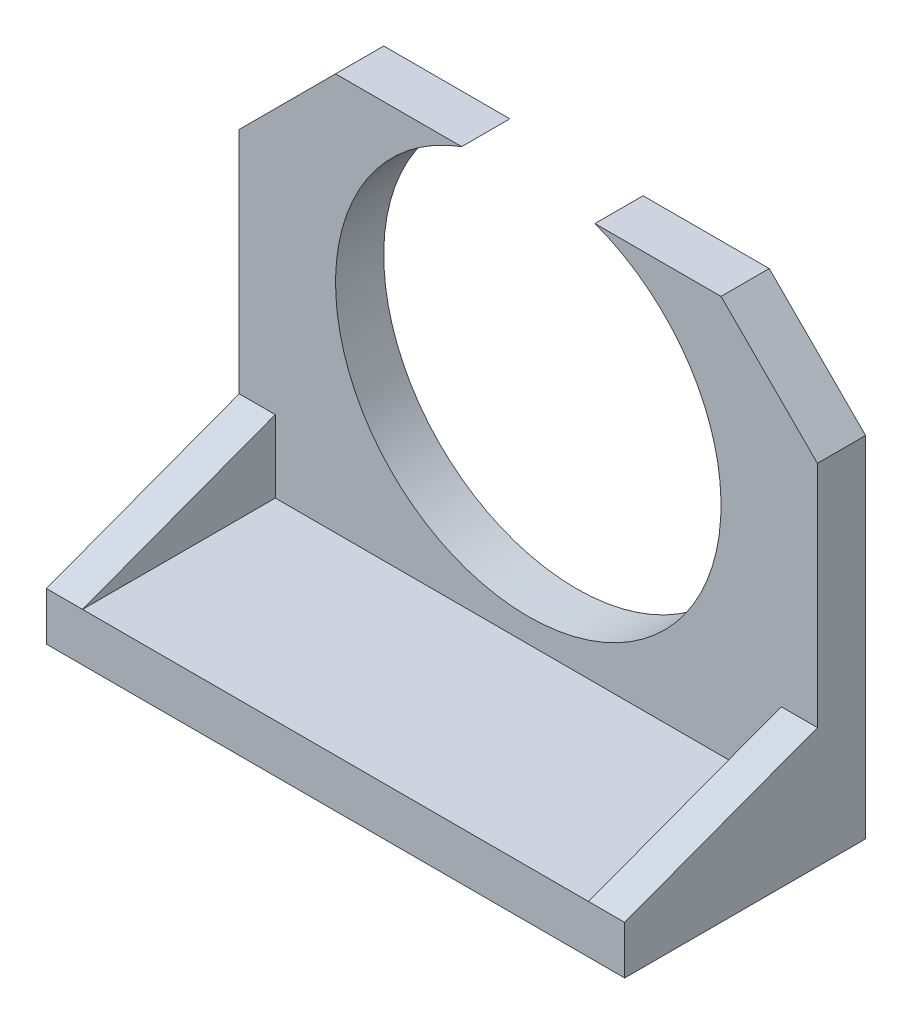
ISO-10303-21;
HEADER;
FILE_DESCRIPTION(('STEP AP214'),'2;1');
FILE_NAME('part.step','',(''),(''),'','','');
FILE_SCHEMA(('AUTOMOTIVE_DESIGN { 1 0 10303 214 1 1 1 1 }'));
ENDSEC;
DATA;
#1=APPLICATION_CONTEXT('core data for automotive mechanical design processes');
#2=APPLICATION_PROTOCOL_DEFINITION('international standard','automotive_design',2000,#1);
#3=PRODUCT_CONTEXT('',#1,'mechanical');
#4=PRODUCT('Part','Part','',(#3));
#5=PRODUCT_RELATED_PRODUCT_CATEGORY('part','',(#4));
#6=PRODUCT_DEFINITION_FORMATION('','',#4);
#7=PRODUCT_DEFINITION_CONTEXT('part definition',#1,'design');
#8=PRODUCT_DEFINITION('design','',#6,#7);
#9=PRODUCT_DEFINITION_SHAPE('','',#8);
#10=(LENGTH_UNIT() NAMED_UNIT(*) SI_UNIT(.MILLI.,.METRE.));
#11=(NAMED_UNIT(*) PLANE_ANGLE_UNIT() SI_UNIT($,.RADIAN.));
#12=(NAMED_UNIT(*) SI_UNIT($,.STERADIAN.) SOLID_ANGLE_UNIT());
#13=UNCERTAINTY_MEASURE_WITH_UNIT(LENGTH_MEASURE(1.E-05),#10,'distance_accuracy_value','');
#14=(GEOMETRIC_REPRESENTATION_CONTEXT(3) GLOBAL_UNCERTAINTY_ASSIGNED_CONTEXT((#13)) GLOBAL_UNIT_ASSIGNED_CONTEXT((#10,
#11,#12)) REPRESENTATION_CONTEXT('',''));
#15=CARTESIAN_POINT('',(0.,0.,0.));
#16=DIRECTION('',(0.,0.,1.));
#17=DIRECTION('',(1.,0.,0.));
#18=AXIS2_PLACEMENT_3D('',#15,#16,#17);
#19=CARTESIAN_POINT('',(0.,18.5,0.));
#20=DIRECTION('',(0.,1.,0.));
#21=DIRECTION('',(0.,0.,1.));
#22=AXIS2_PLACEMENT_3D('',#19,#20,#21);
#23=PLANE('',#22);
#24=DIRECTION('',(0.,0.,1.));
#25=VECTOR('',#24,1.);
#26=CARTESIAN_POINT('',(-8.,18.5,-5.));
#27=LINE('',#26,#25);
#28=CARTESIAN_POINT('',(-8.,18.5,-5.));
#29=VERTEX_POINT('',#28);
#30=CARTESIAN_POINT('',(-8.,18.5,-3.));
#31=VERTEX_POINT('',#30);
#32=EDGE_CURVE('E206',#29,#31,#27,.T.);
#33=ORIENTED_EDGE('',*,*,#32,.T.);
#34=DIRECTION('',(1.,0.,0.));
#35=VECTOR('',#34,1.);
#36=CARTESIAN_POINT('',(-12.,18.5,-3.));
#37=LINE('',#36,#35);
#38=CARTESIAN_POINT('',(-2.76435651932856,18.5,-3.));
#39=VERTEX_POINT('',#38);
#40=EDGE_CURVE('E212',#31,#39,#37,.T.);
#41=ORIENTED_EDGE('',*,*,#40,.T.);
#42=DIRECTION('',(0.,0.,1.));
#43=VECTOR('',#42,1.);
#44=CARTESIAN_POINT('',(-2.76435651932856,18.5,-5.));
#45=LINE('',#44,#43);
#46=CARTESIAN_POINT('',(-2.76435651932856,18.5,-5.));
#47=VERTEX_POINT('',#46);
#48=EDGE_CURVE('E11',#47,#39,#45,.T.);
#49=ORIENTED_EDGE('',*,*,#48,.F.);
#50=DIRECTION('',(-1.,0.,0.));
#51=VECTOR('',#50,1.);
#52=CARTESIAN_POINT('',(-12.,18.5,-5.));
#53=LINE('',#52,#51);
#54=EDGE_CURVE('E201',#47,#29,#53,.T.);
#55=ORIENTED_EDGE('',*,*,#54,.T.);
#56=EDGE_LOOP('',(#33,#41,#49,#55));
#57=FACE_BOUND('',#56,.T.);
#58=ADVANCED_FACE('F33',(#57),#23,.T.);
#59=CARTESIAN_POINT('',(12.,2.,-5.));
#60=DIRECTION('',(-1.,0.,0.));
#61=DIRECTION('',(0.,0.,1.));
#62=AXIS2_PLACEMENT_3D('',#59,#60,#61);
#63=PLANE('',#62);
#64=DIRECTION('',(0.,-1.,0.));
#65=VECTOR('',#64,1.);
#66=CARTESIAN_POINT('',(12.,2.,-5.));
#67=LINE('',#66,#65);
#68=CARTESIAN_POINT('',(12.,14.5,-5.));
#69=VERTEX_POINT('',#68);
#70=CARTESIAN_POINT('',(12.,0.,-5.));
#71=VERTEX_POINT('',#70);
#72=EDGE_CURVE('E179',#69,#71,#67,.T.);
#73=ORIENTED_EDGE('',*,*,#72,.F.);
#74=DIRECTION('',(0.,0.,1.));
#75=VECTOR('',#74,1.);
#76=CARTESIAN_POINT('',(12.,14.5,-5.));
#77=LINE('',#76,#75);
#78=CARTESIAN_POINT('',(12.,14.5,-3.));
#79=VERTEX_POINT('',#78);
#80=EDGE_CURVE('E248',#69,#79,#77,.T.);
#81=ORIENTED_EDGE('',*,*,#80,.T.);
#82=DIRECTION('',(0.,-1.,0.));
#83=VECTOR('',#82,1.);
#84=CARTESIAN_POINT('',(12.,18.5,-3.));
#85=LINE('',#84,#83);
#86=CARTESIAN_POINT('',(12.,5.,-3.));
#87=VERTEX_POINT('',#86);
#88=EDGE_CURVE('E214',#79,#87,#85,.T.);
#89=ORIENTED_EDGE('',*,*,#88,.T.);
#90=DIRECTION('',(0.,-0.351123441588392,0.936329177569045));
#91=VECTOR('',#90,1.);
#92=CARTESIAN_POINT('',(12.,5.,-3.));
#93=LINE('',#92,#91);
#94=CARTESIAN_POINT('',(12.,2.,5.));
#95=VERTEX_POINT('',#94);
#96=EDGE_CURVE('E145',#87,#95,#93,.T.);
#97=ORIENTED_EDGE('',*,*,#96,.T.);
#98=DIRECTION('',(0.,-1.,0.));
#99=VECTOR('',#98,1.);
#100=CARTESIAN_POINT('',(12.,2.,5.));
#101=LINE('',#100,#99);
#102=CARTESIAN_POINT('',(12.,0.,5.));
#103=VERTEX_POINT('',#102);
#104=EDGE_CURVE('E154',#95,#103,#101,.T.);
#105=ORIENTED_EDGE('',*,*,#104,.T.);
#106=DIRECTION('',(0.,0.,-1.));
#107=VECTOR('',#106,1.);
#108=CARTESIAN_POINT('',(12.,0.,-5.));
#109=LINE('',#108,#107);
#110=EDGE_CURVE('E166',#103,#71,#109,.T.);
#111=ORIENTED_EDGE('',*,*,#110,.T.);
#112=EDGE_LOOP('',(#73,#81,#89,#97,#105,#111));
#113=FACE_BOUND('',#112,.T.);
#114=ADVANCED_FACE('F35',(#113),#63,.F.);
#115=CARTESIAN_POINT('',(-12.,2.,-5.));
#116=DIRECTION('',(0.,0.,1.));
#117=DIRECTION('',(1.,0.,0.));
#118=AXIS2_PLACEMENT_3D('',#115,#116,#117);
#119=PLANE('',#118);
#120=DIRECTION('',(0.,-1.,0.));
#121=VECTOR('',#120,1.);
#122=CARTESIAN_POINT('',(-12.,2.,-5.));
#123=LINE('',#122,#121);
#124=CARTESIAN_POINT('',(-12.,14.5,-5.));
#125=VERTEX_POINT('',#124);
#126=CARTESIAN_POINT('',(-12.,0.,-5.));
#127=VERTEX_POINT('',#126);
#128=EDGE_CURVE('E177',#125,#127,#123,.T.);
#129=ORIENTED_EDGE('',*,*,#128,.F.);
#130=DIRECTION('',(0.707106781186548,0.707106781186548,0.));
#131=VECTOR('',#130,1.);
#132=CARTESIAN_POINT('',(-8.,18.5,-5.));
#133=LINE('',#132,#131);
#134=EDGE_CURVE('E244',#125,#29,#133,.T.);
#135=ORIENTED_EDGE('',*,*,#134,.T.);
#136=ORIENTED_EDGE('',*,*,#54,.F.);
#137=CARTESIAN_POINT('',(0.,10.9927812717328,-5.));
#138=DIRECTION('',(0.,0.,1.));
#139=DIRECTION('',(1.,0.,0.));
#140=AXIS2_PLACEMENT_3D('',#137,#138,#139);
#141=CIRCLE('',#140,8.);
#142=CARTESIAN_POINT('',(2.76435651932856,18.5,-5.));
#143=VERTEX_POINT('',#142);
#144=EDGE_CURVE('E185',#47,#143,#141,.T.);
#145=ORIENTED_EDGE('',*,*,#144,.T.);
#146=CARTESIAN_POINT('',(8.,18.5,-5.));
#147=VERTEX_POINT('',#146);
#148=EDGE_CURVE('E198',#147,#143,#53,.T.);
#149=ORIENTED_EDGE('',*,*,#148,.F.);
#150=DIRECTION('',(0.707106781186548,-0.707106781186548,0.));
#151=VECTOR('',#150,1.);
#152=CARTESIAN_POINT('',(8.,18.5,-5.));
#153=LINE('',#152,#151);
#154=EDGE_CURVE('E252',#147,#69,#153,.T.);
#155=ORIENTED_EDGE('',*,*,#154,.T.);
#156=ORIENTED_EDGE('',*,*,#72,.T.);
#157=DIRECTION('',(-1.,0.,0.));
#158=VECTOR('',#157,1.);
#159=CARTESIAN_POINT('',(-12.,0.,-5.));
#160=LINE('',#159,#158);
#161=EDGE_CURVE('E169',#71,#127,#160,.T.);
#162=ORIENTED_EDGE('',*,*,#161,.T.);
#163=EDGE_LOOP('',(#129,#135,#136,#145,#149,#155,#156,#162));
#164=FACE_BOUND('',#163,.T.);
#165=ADVANCED_FACE('F196',(#164),#119,.F.);
#166=CARTESIAN_POINT('',(-12.,2.,-5.));
#167=DIRECTION('',(1.,0.,0.));
#168=DIRECTION('',(0.,0.,-1.));
#169=AXIS2_PLACEMENT_3D('',#166,#167,#168);
#170=PLANE('',#169);
#171=DIRECTION('',(0.,-1.,0.));
#172=VECTOR('',#171,1.);
#173=CARTESIAN_POINT('',(-12.,2.,5.));
#174=LINE('',#173,#172);
#175=CARTESIAN_POINT('',(-12.,2.,5.));
#176=VERTEX_POINT('',#175);
#177=CARTESIAN_POINT('',(-12.,0.,5.));
#178=VERTEX_POINT('',#177);
#179=EDGE_CURVE('E174',#176,#178,#174,.T.);
#180=ORIENTED_EDGE('',*,*,#179,.F.);
#181=DIRECTION('',(0.,0.351123441588392,-0.936329177569045));
#182=VECTOR('',#181,1.);
#183=CARTESIAN_POINT('',(-12.,5.,-3.));
#184=LINE('',#183,#182);
#185=CARTESIAN_POINT('',(-12.,5.,-3.));
#186=VERTEX_POINT('',#185);
#187=EDGE_CURVE('E230',#176,#186,#184,.T.);
#188=ORIENTED_EDGE('',*,*,#187,.T.);
#189=DIRECTION('',(0.,-1.,0.));
#190=VECTOR('',#189,1.);
#191=CARTESIAN_POINT('',(-12.,18.5,-3.));
#192=LINE('',#191,#190);
#193=CARTESIAN_POINT('',(-12.,14.5,-3.));
#194=VERTEX_POINT('',#193);
#195=EDGE_CURVE('E164',#194,#186,#192,.T.);
#196=ORIENTED_EDGE('',*,*,#195,.F.);
#197=DIRECTION('',(0.,0.,1.));
#198=VECTOR('',#197,1.);
#199=CARTESIAN_POINT('',(-12.,14.5,-5.));
#200=LINE('',#199,#198);
#201=EDGE_CURVE('E246',#125,#194,#200,.T.);
#202=ORIENTED_EDGE('',*,*,#201,.F.);
#203=ORIENTED_EDGE('',*,*,#128,.T.);
#204=DIRECTION('',(0.,0.,1.));
#205=VECTOR('',#204,1.);
#206=CARTESIAN_POINT('',(-12.,0.,-5.));
#207=LINE('',#206,#205);
#208=EDGE_CURVE('E160',#127,#178,#207,.T.);
#209=ORIENTED_EDGE('',*,*,#208,.T.);
#210=EDGE_LOOP('',(#180,#188,#196,#202,#203,#209));
#211=FACE_BOUND('',#210,.T.);
#212=ADVANCED_FACE('F237',(#211),#170,.F.);
#213=CARTESIAN_POINT('',(-12.,2.,5.));
#214=DIRECTION('',(0.,0.,-1.));
#215=DIRECTION('',(-1.,0.,0.));
#216=AXIS2_PLACEMENT_3D('',#213,#214,#215);
#217=PLANE('',#216);
#218=DIRECTION('',(1.,0.,0.));
#219=VECTOR('',#218,1.);
#220=CARTESIAN_POINT('',(-12.,0.,5.));
#221=LINE('',#220,#219);
#222=EDGE_CURVE('E158',#178,#103,#221,.T.);
#223=ORIENTED_EDGE('',*,*,#222,.T.);
#224=ORIENTED_EDGE('',*,*,#104,.F.);
#225=DIRECTION('',(1.,0.,0.));
#226=VECTOR('',#225,1.);
#227=CARTESIAN_POINT('',(10.5,2.,5.));
#228=LINE('',#227,#226);
#229=CARTESIAN_POINT('',(10.5,2.,5.));
#230=VERTEX_POINT('',#229);
#231=EDGE_CURVE('E141',#230,#95,#228,.T.);
#232=ORIENTED_EDGE('',*,*,#231,.F.);
#233=DIRECTION('',(1.,0.,0.));
#234=VECTOR('',#233,1.);
#235=CARTESIAN_POINT('',(-12.,2.,5.));
#236=LINE('',#235,#234);
#237=CARTESIAN_POINT('',(-10.5,2.,5.));
#238=VERTEX_POINT('',#237);
#239=EDGE_CURVE('E151',#238,#230,#236,.T.);
#240=ORIENTED_EDGE('',*,*,#239,.F.);
#241=EDGE_CURVE('E157',#176,#238,#236,.T.);
#242=ORIENTED_EDGE('',*,*,#241,.F.);
#243=ORIENTED_EDGE('',*,*,#179,.T.);
#244=EDGE_LOOP('',(#223,#224,#232,#240,#242,#243));
#245=FACE_BOUND('',#244,.T.);
#246=ADVANCED_FACE('F149',(#245),#217,.F.);
#247=CARTESIAN_POINT('',(0.,2.,0.));
#248=DIRECTION('',(0.,1.,0.));
#249=DIRECTION('',(0.,0.,1.));
#250=AXIS2_PLACEMENT_3D('',#247,#248,#249);
#251=PLANE('',#250);
#252=DIRECTION('',(0.,0.,-1.));
#253=VECTOR('',#252,1.);
#254=CARTESIAN_POINT('',(10.5,2.,5.));
#255=LINE('',#254,#253);
#256=CARTESIAN_POINT('',(10.5,2.,-3.));
#257=VERTEX_POINT('',#256);
#258=EDGE_CURVE('E130',#230,#257,#255,.T.);
#259=ORIENTED_EDGE('',*,*,#258,.T.);
#260=DIRECTION('',(1.,0.,0.));
#261=VECTOR('',#260,1.);
#262=CARTESIAN_POINT('',(-12.,2.,-3.));
#263=LINE('',#262,#261);
#264=CARTESIAN_POINT('',(-10.5,2.,-3.));
#265=VERTEX_POINT('',#264);
#266=EDGE_CURVE('E202',#265,#257,#263,.T.);
#267=ORIENTED_EDGE('',*,*,#266,.F.);
#268=DIRECTION('',(0.,0.,1.));
#269=VECTOR('',#268,1.);
#270=CARTESIAN_POINT('',(-10.5,2.,5.));
#271=LINE('',#270,#269);
#272=EDGE_CURVE('E48',#265,#238,#271,.T.);
#273=ORIENTED_EDGE('',*,*,#272,.T.);
#274=ORIENTED_EDGE('',*,*,#239,.T.);
#275=EDGE_LOOP('',(#259,#267,#273,#274));
#276=FACE_BOUND('',#275,.T.);
#277=ADVANCED_FACE('F156',(#276),#251,.T.);
#278=CARTESIAN_POINT('',(0.,0.,0.));
#279=DIRECTION('',(0.,1.,0.));
#280=DIRECTION('',(0.,0.,1.));
#281=AXIS2_PLACEMENT_3D('',#278,#279,#280);
#282=PLANE('',#281);
#283=ORIENTED_EDGE('',*,*,#110,.F.);
#284=ORIENTED_EDGE('',*,*,#222,.F.);
#285=ORIENTED_EDGE('',*,*,#208,.F.);
#286=ORIENTED_EDGE('',*,*,#161,.F.);
#287=EDGE_LOOP('',(#283,#284,#285,#286));
#288=FACE_BOUND('',#287,.T.);
#289=ADVANCED_FACE('F267',(#288),#282,.F.);
#290=CARTESIAN_POINT('',(-12.,18.5,-3.));
#291=DIRECTION('',(0.,0.,-1.));
#292=DIRECTION('',(-1.,0.,0.));
#293=AXIS2_PLACEMENT_3D('',#290,#291,#292);
#294=PLANE('',#293);
#295=DIRECTION('',(0.,1.,0.));
#296=VECTOR('',#295,1.);
#297=CARTESIAN_POINT('',(10.5,2.,-3.));
#298=LINE('',#297,#296);
#299=CARTESIAN_POINT('',(10.5,5.,-3.));
#300=VERTEX_POINT('',#299);
#301=EDGE_CURVE('E135',#257,#300,#298,.T.);
#302=ORIENTED_EDGE('',*,*,#301,.T.);
#303=DIRECTION('',(1.,0.,0.));
#304=VECTOR('',#303,1.);
#305=CARTESIAN_POINT('',(10.5,5.,-3.));
#306=LINE('',#305,#304);
#307=EDGE_CURVE('E144',#300,#87,#306,.T.);
#308=ORIENTED_EDGE('',*,*,#307,.T.);
#309=ORIENTED_EDGE('',*,*,#88,.F.);
#310=DIRECTION('',(0.707106781186548,-0.707106781186548,0.));
#311=VECTOR('',#310,1.);
#312=CARTESIAN_POINT('',(8.,18.5,-3.));
#313=LINE('',#312,#311);
#314=CARTESIAN_POINT('',(8.,18.5,-3.));
#315=VERTEX_POINT('',#314);
#316=EDGE_CURVE('E234',#315,#79,#313,.T.);
#317=ORIENTED_EDGE('',*,*,#316,.F.);
#318=CARTESIAN_POINT('',(2.76435651932857,18.5,-3.));
#319=VERTEX_POINT('',#318);
#320=EDGE_CURVE('E204',#319,#315,#37,.T.);
#321=ORIENTED_EDGE('',*,*,#320,.F.);
#322=CARTESIAN_POINT('',(0.,10.9927812717328,-3.));
#323=DIRECTION('',(0.,0.,1.));
#324=DIRECTION('',(1.,0.,0.));
#325=AXIS2_PLACEMENT_3D('',#322,#323,#324);
#326=CIRCLE('',#325,8.);
#327=EDGE_CURVE('E188',#39,#319,#326,.T.);
#328=ORIENTED_EDGE('',*,*,#327,.F.);
#329=ORIENTED_EDGE('',*,*,#40,.F.);
#330=DIRECTION('',(0.707106781186548,0.707106781186548,0.));
#331=VECTOR('',#330,1.);
#332=CARTESIAN_POINT('',(-8.,18.5,-3.));
#333=LINE('',#332,#331);
#334=EDGE_CURVE('E223',#194,#31,#333,.T.);
#335=ORIENTED_EDGE('',*,*,#334,.F.);
#336=ORIENTED_EDGE('',*,*,#195,.T.);
#337=DIRECTION('',(-1.,0.,0.));
#338=VECTOR('',#337,1.);
#339=CARTESIAN_POINT('',(-10.5,5.,-3.));
#340=LINE('',#339,#338);
#341=CARTESIAN_POINT('',(-10.5,5.,-3.));
#342=VERTEX_POINT('',#341);
#343=EDGE_CURVE('E56',#342,#186,#340,.T.);
#344=ORIENTED_EDGE('',*,*,#343,.F.);
#345=DIRECTION('',(0.,-1.,0.));
#346=VECTOR('',#345,1.);
#347=CARTESIAN_POINT('',(-10.5,2.,-3.));
#348=LINE('',#347,#346);
#349=EDGE_CURVE('E235',#342,#265,#348,.T.);
#350=ORIENTED_EDGE('',*,*,#349,.T.);
#351=ORIENTED_EDGE('',*,*,#266,.T.);
#352=EDGE_LOOP('',(#302,#308,#309,#317,#321,#328,#329,#335,#336,#344,#350,#351));
#353=FACE_BOUND('',#352,.T.);
#354=ADVANCED_FACE('F221',(#353),#294,.F.);
#355=DIRECTION('',(0.,0.,1.));
#356=VECTOR('',#355,1.);
#357=CARTESIAN_POINT('',(8.,18.5,-5.));
#358=LINE('',#357,#356);
#359=EDGE_CURVE('E209',#147,#315,#358,.T.);
#360=ORIENTED_EDGE('',*,*,#359,.F.);
#361=ORIENTED_EDGE('',*,*,#148,.T.);
#362=DIRECTION('',(0.,0.,1.));
#363=VECTOR('',#362,1.);
#364=CARTESIAN_POINT('',(2.76435651932856,18.5,-5.));
#365=LINE('',#364,#363);
#366=EDGE_CURVE('E41',#319,#143,#365,.F.);
#367=ORIENTED_EDGE('',*,*,#366,.F.);
#368=ORIENTED_EDGE('',*,*,#320,.T.);
#369=EDGE_LOOP('',(#360,#361,#367,#368));
#370=FACE_BOUND('',#369,.T.);
#371=ADVANCED_FACE('F259',(#370),#23,.T.);
#372=CARTESIAN_POINT('',(0.,10.9927812717328,-5.));
#373=DIRECTION('',(0.,0.,1.));
#374=DIRECTION('',(1.,0.,0.));
#375=AXIS2_PLACEMENT_3D('',#372,#373,#374);
#376=CYLINDRICAL_SURFACE('',#375,8.);
#377=ORIENTED_EDGE('',*,*,#48,.T.);
#378=ORIENTED_EDGE('',*,*,#327,.T.);
#379=ORIENTED_EDGE('',*,*,#366,.T.);
#380=ORIENTED_EDGE('',*,*,#144,.F.);
#381=EDGE_LOOP('',(#377,#378,#379,#380));
#382=FACE_BOUND('',#381,.T.);
#383=ADVANCED_FACE('F184',(#382),#376,.F.);
#384=CARTESIAN_POINT('',(8.,18.5,-5.));
#385=DIRECTION('',(-0.707106781186547,-0.707106781186547,0.));
#386=DIRECTION('',(0.707106781186548,-0.707106781186548,0.));
#387=AXIS2_PLACEMENT_3D('',#384,#385,#386);
#388=PLANE('',#387);
#389=ORIENTED_EDGE('',*,*,#316,.T.);
#390=ORIENTED_EDGE('',*,*,#80,.F.);
#391=ORIENTED_EDGE('',*,*,#154,.F.);
#392=ORIENTED_EDGE('',*,*,#359,.T.);
#393=EDGE_LOOP('',(#389,#390,#391,#392));
#394=FACE_BOUND('',#393,.T.);
#395=ADVANCED_FACE('F258',(#394),#388,.F.);
#396=CARTESIAN_POINT('',(-8.,18.5,-5.));
#397=DIRECTION('',(0.707106781186547,-0.707106781186547,0.));
#398=DIRECTION('',(0.707106781186548,0.707106781186548,0.));
#399=AXIS2_PLACEMENT_3D('',#396,#397,#398);
#400=PLANE('',#399);
#401=ORIENTED_EDGE('',*,*,#334,.T.);
#402=ORIENTED_EDGE('',*,*,#32,.F.);
#403=ORIENTED_EDGE('',*,*,#134,.F.);
#404=ORIENTED_EDGE('',*,*,#201,.T.);
#405=EDGE_LOOP('',(#401,#402,#403,#404));
#406=FACE_BOUND('',#405,.T.);
#407=ADVANCED_FACE('F275',(#406),#400,.F.);
#408=CARTESIAN_POINT('',(-10.5,5.,-3.));
#409=DIRECTION('',(0.,0.936329177569044,0.351123441588392));
#410=DIRECTION('',(0.,-0.351123441588392,0.936329177569045));
#411=AXIS2_PLACEMENT_3D('',#408,#409,#410);
#412=PLANE('',#411);
#413=ORIENTED_EDGE('',*,*,#187,.F.);
#414=ORIENTED_EDGE('',*,*,#241,.T.);
#415=DIRECTION('',(0.,0.351123441588392,-0.936329177569045));
#416=VECTOR('',#415,1.);
#417=CARTESIAN_POINT('',(-10.5,5.,-3.));
#418=LINE('',#417,#416);
#419=EDGE_CURVE('E232',#238,#342,#418,.T.);
#420=ORIENTED_EDGE('',*,*,#419,.T.);
#421=ORIENTED_EDGE('',*,*,#343,.T.);
#422=EDGE_LOOP('',(#413,#414,#420,#421));
#423=FACE_BOUND('',#422,.T.);
#424=ADVANCED_FACE('F229',(#423),#412,.T.);
#425=CARTESIAN_POINT('',(-10.5,0.,0.));
#426=DIRECTION('',(1.,0.,0.));
#427=DIRECTION('',(0.,0.,-1.));
#428=AXIS2_PLACEMENT_3D('',#425,#426,#427);
#429=PLANE('',#428);
#430=ORIENTED_EDGE('',*,*,#272,.F.);
#431=ORIENTED_EDGE('',*,*,#349,.F.);
#432=ORIENTED_EDGE('',*,*,#419,.F.);
#433=EDGE_LOOP('',(#430,#431,#432));
#434=FACE_BOUND('',#433,.T.);
#435=ADVANCED_FACE('F284',(#434),#429,.T.);
#436=CARTESIAN_POINT('',(10.5,5.,-3.));
#437=DIRECTION('',(0.,0.936329177569044,0.351123441588392));
#438=DIRECTION('',(0.,-0.351123441588392,0.936329177569045));
#439=AXIS2_PLACEMENT_3D('',#436,#437,#438);
#440=PLANE('',#439);
#441=ORIENTED_EDGE('',*,*,#96,.F.);
#442=ORIENTED_EDGE('',*,*,#307,.F.);
#443=DIRECTION('',(0.,-0.351123441588392,0.936329177569045));
#444=VECTOR('',#443,1.);
#445=CARTESIAN_POINT('',(10.5,5.,-3.));
#446=LINE('',#445,#444);
#447=EDGE_CURVE('E133',#300,#230,#446,.T.);
#448=ORIENTED_EDGE('',*,*,#447,.T.);
#449=ORIENTED_EDGE('',*,*,#231,.T.);
#450=EDGE_LOOP('',(#441,#442,#448,#449));
#451=FACE_BOUND('',#450,.T.);
#452=ADVANCED_FACE('F140',(#451),#440,.T.);
#453=CARTESIAN_POINT('',(10.5,0.,0.));
#454=DIRECTION('',(-1.,0.,0.));
#455=DIRECTION('',(0.,0.,1.));
#456=AXIS2_PLACEMENT_3D('',#453,#454,#455);
#457=PLANE('',#456);
#458=ORIENTED_EDGE('',*,*,#447,.F.);
#459=ORIENTED_EDGE('',*,*,#301,.F.);
#460=ORIENTED_EDGE('',*,*,#258,.F.);
#461=EDGE_LOOP('',(#458,#459,#460));
#462=FACE_BOUND('',#461,.T.);
#463=ADVANCED_FACE('F132',(#462),#457,.T.);
#464=CLOSED_SHELL('',(#58,#114,#165,#212,#246,#277,#289,#354,#371,#383,#395,#407,#424,#435,#452,#463));
#465=MANIFOLD_SOLID_BREP('B2',#464);
#466=ADVANCED_BREP_SHAPE_REPRESENTATION('',(#18,#465),#14);
#467=SHAPE_DEFINITION_REPRESENTATION(#9,#466);
ENDSEC;
END-ISO-10303-21;
